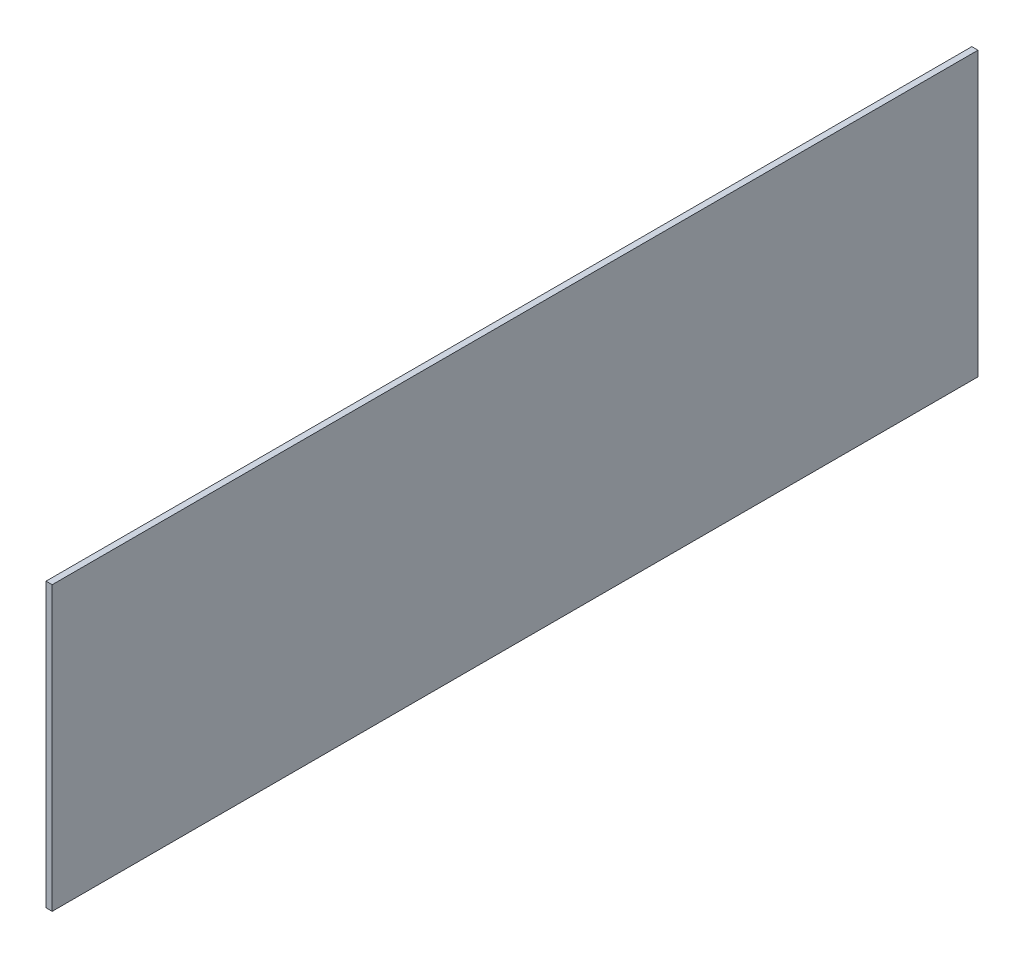
ISO-10303-21;
HEADER;
FILE_DESCRIPTION(('STEP AP214'),'2;1');
FILE_NAME('part.step','',(''),(''),'','','');
FILE_SCHEMA(('AUTOMOTIVE_DESIGN { 1 0 10303 214 1 1 1 1 }'));
ENDSEC;
DATA;
#1=APPLICATION_CONTEXT('core data for automotive mechanical design processes');
#2=APPLICATION_PROTOCOL_DEFINITION('international standard','automotive_design',2000,#1);
#3=PRODUCT_CONTEXT('',#1,'mechanical');
#4=PRODUCT('Part','Part','',(#3));
#5=PRODUCT_RELATED_PRODUCT_CATEGORY('part','',(#4));
#6=PRODUCT_DEFINITION_FORMATION('','',#4);
#7=PRODUCT_DEFINITION_CONTEXT('part definition',#1,'design');
#8=PRODUCT_DEFINITION('design','',#6,#7);
#9=PRODUCT_DEFINITION_SHAPE('','',#8);
#10=(LENGTH_UNIT() NAMED_UNIT(*) SI_UNIT(.MILLI.,.METRE.));
#11=(NAMED_UNIT(*) PLANE_ANGLE_UNIT() SI_UNIT($,.RADIAN.));
#12=(NAMED_UNIT(*) SI_UNIT($,.STERADIAN.) SOLID_ANGLE_UNIT());
#13=UNCERTAINTY_MEASURE_WITH_UNIT(LENGTH_MEASURE(1.E-05),#10,'distance_accuracy_value','');
#14=(GEOMETRIC_REPRESENTATION_CONTEXT(3) GLOBAL_UNCERTAINTY_ASSIGNED_CONTEXT((#13)) GLOBAL_UNIT_ASSIGNED_CONTEXT((#10,
#11,#12)) REPRESENTATION_CONTEXT('',''));
#15=CARTESIAN_POINT('',(0.,0.,0.));
#16=DIRECTION('',(0.,0.,1.));
#17=DIRECTION('',(1.,0.,0.));
#18=AXIS2_PLACEMENT_3D('',#15,#16,#17);
#19=CARTESIAN_POINT('',(-50.8235294117646,130.588235294117,1800.));
#20=DIRECTION('',(1.,0.,0.));
#21=DIRECTION('',(0.,1.,0.));
#22=AXIS2_PLACEMENT_3D('',#19,#20,#21);
#23=PLANE('',#22);
#24=DIRECTION('',(0.,-1.,0.));
#25=VECTOR('',#24,1.);
#26=CARTESIAN_POINT('',(-50.8235294117646,130.588235294117,0.));
#27=LINE('',#26,#25);
#28=CARTESIAN_POINT('',(-50.8235294117646,130.588235294117,0.));
#29=VERTEX_POINT('',#28);
#30=CARTESIAN_POINT('',(-50.8235294117645,-419.411764705883,0.));
#31=VERTEX_POINT('',#30);
#32=EDGE_CURVE('E107',#29,#31,#27,.T.);
#33=ORIENTED_EDGE('',*,*,#32,.T.);
#34=DIRECTION('',(0.,0.,-1.));
#35=VECTOR('',#34,1.);
#36=CARTESIAN_POINT('',(-50.8235294117645,-419.411764705883,1800.));
#37=LINE('',#36,#35);
#38=CARTESIAN_POINT('',(-50.8235294117645,-419.411764705883,1800.));
#39=VERTEX_POINT('',#38);
#40=EDGE_CURVE('E11',#39,#31,#37,.T.);
#41=ORIENTED_EDGE('',*,*,#40,.F.);
#42=DIRECTION('',(0.,-1.,0.));
#43=VECTOR('',#42,1.);
#44=CARTESIAN_POINT('',(-50.8235294117646,130.588235294117,1800.));
#45=LINE('',#44,#43);
#46=CARTESIAN_POINT('',(-50.8235294117646,130.588235294117,1800.));
#47=VERTEX_POINT('',#46);
#48=EDGE_CURVE('E91',#47,#39,#45,.T.);
#49=ORIENTED_EDGE('',*,*,#48,.F.);
#50=DIRECTION('',(0.,0.,-1.));
#51=VECTOR('',#50,1.);
#52=CARTESIAN_POINT('',(-50.8235294117646,130.588235294117,1800.));
#53=LINE('',#52,#51);
#54=EDGE_CURVE('E103',#47,#29,#53,.T.);
#55=ORIENTED_EDGE('',*,*,#54,.T.);
#56=EDGE_LOOP('',(#33,#41,#49,#55));
#57=FACE_BOUND('',#56,.T.);
#58=ADVANCED_FACE('F39',(#57),#23,.F.);
#59=CARTESIAN_POINT('',(-50.8235294117645,-419.411764705883,1800.));
#60=DIRECTION('',(0.,1.,0.));
#61=DIRECTION('',(0.,0.,1.));
#62=AXIS2_PLACEMENT_3D('',#59,#60,#61);
#63=PLANE('',#62);
#64=DIRECTION('',(1.,0.,0.));
#65=VECTOR('',#64,1.);
#66=CARTESIAN_POINT('',(-50.8235294117645,-419.411764705883,0.));
#67=LINE('',#66,#65);
#68=CARTESIAN_POINT('',(-38.8235294117645,-419.411764705883,0.));
#69=VERTEX_POINT('',#68);
#70=EDGE_CURVE('E96',#31,#69,#67,.T.);
#71=ORIENTED_EDGE('',*,*,#70,.T.);
#72=DIRECTION('',(0.,0.,-1.));
#73=VECTOR('',#72,1.);
#74=CARTESIAN_POINT('',(-38.8235294117645,-419.411764705883,1800.));
#75=LINE('',#74,#73);
#76=CARTESIAN_POINT('',(-38.8235294117645,-419.411764705883,1800.));
#77=VERTEX_POINT('',#76);
#78=EDGE_CURVE('E48',#77,#69,#75,.T.);
#79=ORIENTED_EDGE('',*,*,#78,.F.);
#80=DIRECTION('',(1.,0.,0.));
#81=VECTOR('',#80,1.);
#82=CARTESIAN_POINT('',(-50.8235294117645,-419.411764705883,1800.));
#83=LINE('',#82,#81);
#84=EDGE_CURVE('E86',#39,#77,#83,.T.);
#85=ORIENTED_EDGE('',*,*,#84,.F.);
#86=ORIENTED_EDGE('',*,*,#40,.T.);
#87=EDGE_LOOP('',(#71,#79,#85,#86));
#88=FACE_BOUND('',#87,.T.);
#89=ADVANCED_FACE('F95',(#88),#63,.F.);
#90=CARTESIAN_POINT('',(-38.8235294117646,130.588235294117,1800.));
#91=DIRECTION('',(-1.,0.,0.));
#92=DIRECTION('',(0.,-1.,0.));
#93=AXIS2_PLACEMENT_3D('',#90,#91,#92);
#94=PLANE('',#93);
#95=DIRECTION('',(0.,1.,0.));
#96=VECTOR('',#95,1.);
#97=CARTESIAN_POINT('',(-38.8235294117646,130.588235294117,0.));
#98=LINE('',#97,#96);
#99=CARTESIAN_POINT('',(-38.8235294117646,130.588235294117,0.));
#100=VERTEX_POINT('',#99);
#101=EDGE_CURVE('E73',#69,#100,#98,.T.);
#102=ORIENTED_EDGE('',*,*,#101,.T.);
#103=DIRECTION('',(0.,0.,-1.));
#104=VECTOR('',#103,1.);
#105=CARTESIAN_POINT('',(-38.8235294117646,130.588235294117,1800.));
#106=LINE('',#105,#104);
#107=CARTESIAN_POINT('',(-38.8235294117646,130.588235294117,1800.));
#108=VERTEX_POINT('',#107);
#109=EDGE_CURVE('E98',#108,#100,#106,.T.);
#110=ORIENTED_EDGE('',*,*,#109,.F.);
#111=DIRECTION('',(0.,1.,0.));
#112=VECTOR('',#111,1.);
#113=CARTESIAN_POINT('',(-38.8235294117646,130.588235294117,1800.));
#114=LINE('',#113,#112);
#115=EDGE_CURVE('E89',#77,#108,#114,.T.);
#116=ORIENTED_EDGE('',*,*,#115,.F.);
#117=ORIENTED_EDGE('',*,*,#78,.T.);
#118=EDGE_LOOP('',(#102,#110,#116,#117));
#119=FACE_BOUND('',#118,.T.);
#120=ADVANCED_FACE('F99',(#119),#94,.F.);
#121=CARTESIAN_POINT('',(-50.8235294117646,130.588235294117,1800.));
#122=DIRECTION('',(0.,-1.,0.));
#123=DIRECTION('',(0.,0.,-1.));
#124=AXIS2_PLACEMENT_3D('',#121,#122,#123);
#125=PLANE('',#124);
#126=DIRECTION('',(-1.,0.,0.));
#127=VECTOR('',#126,1.);
#128=CARTESIAN_POINT('',(-50.8235294117646,130.588235294117,0.));
#129=LINE('',#128,#127);
#130=EDGE_CURVE('E79',#100,#29,#129,.T.);
#131=ORIENTED_EDGE('',*,*,#130,.T.);
#132=ORIENTED_EDGE('',*,*,#54,.F.);
#133=DIRECTION('',(-1.,0.,0.));
#134=VECTOR('',#133,1.);
#135=CARTESIAN_POINT('',(-50.8235294117646,130.588235294117,1800.));
#136=LINE('',#135,#134);
#137=EDGE_CURVE('E56',#108,#47,#136,.T.);
#138=ORIENTED_EDGE('',*,*,#137,.F.);
#139=ORIENTED_EDGE('',*,*,#109,.T.);
#140=EDGE_LOOP('',(#131,#132,#138,#139));
#141=FACE_BOUND('',#140,.T.);
#142=ADVANCED_FACE('F120',(#141),#125,.F.);
#143=CARTESIAN_POINT('',(0.,0.,1800.));
#144=DIRECTION('',(0.,0.,1.));
#145=DIRECTION('',(1.,0.,0.));
#146=AXIS2_PLACEMENT_3D('',#143,#144,#145);
#147=PLANE('',#146);
#148=ORIENTED_EDGE('',*,*,#48,.T.);
#149=ORIENTED_EDGE('',*,*,#84,.T.);
#150=ORIENTED_EDGE('',*,*,#115,.T.);
#151=ORIENTED_EDGE('',*,*,#137,.T.);
#152=EDGE_LOOP('',(#148,#149,#150,#151));
#153=FACE_BOUND('',#152,.T.);
#154=ADVANCED_FACE('F87',(#153),#147,.T.);
#155=CARTESIAN_POINT('',(0.,0.,0.));
#156=DIRECTION('',(0.,0.,1.));
#157=DIRECTION('',(1.,0.,0.));
#158=AXIS2_PLACEMENT_3D('',#155,#156,#157);
#159=PLANE('',#158);
#160=ORIENTED_EDGE('',*,*,#32,.F.);
#161=ORIENTED_EDGE('',*,*,#130,.F.);
#162=ORIENTED_EDGE('',*,*,#101,.F.);
#163=ORIENTED_EDGE('',*,*,#70,.F.);
#164=EDGE_LOOP('',(#160,#161,#162,#163));
#165=FACE_BOUND('',#164,.T.);
#166=ADVANCED_FACE('F123',(#165),#159,.F.);
#167=CLOSED_SHELL('',(#58,#89,#120,#142,#154,#166));
#168=MANIFOLD_SOLID_BREP('B2',#167);
#169=ADVANCED_BREP_SHAPE_REPRESENTATION('',(#18,#168),#14);
#170=SHAPE_DEFINITION_REPRESENTATION(#9,#169);
ENDSEC;
END-ISO-10303-21;
